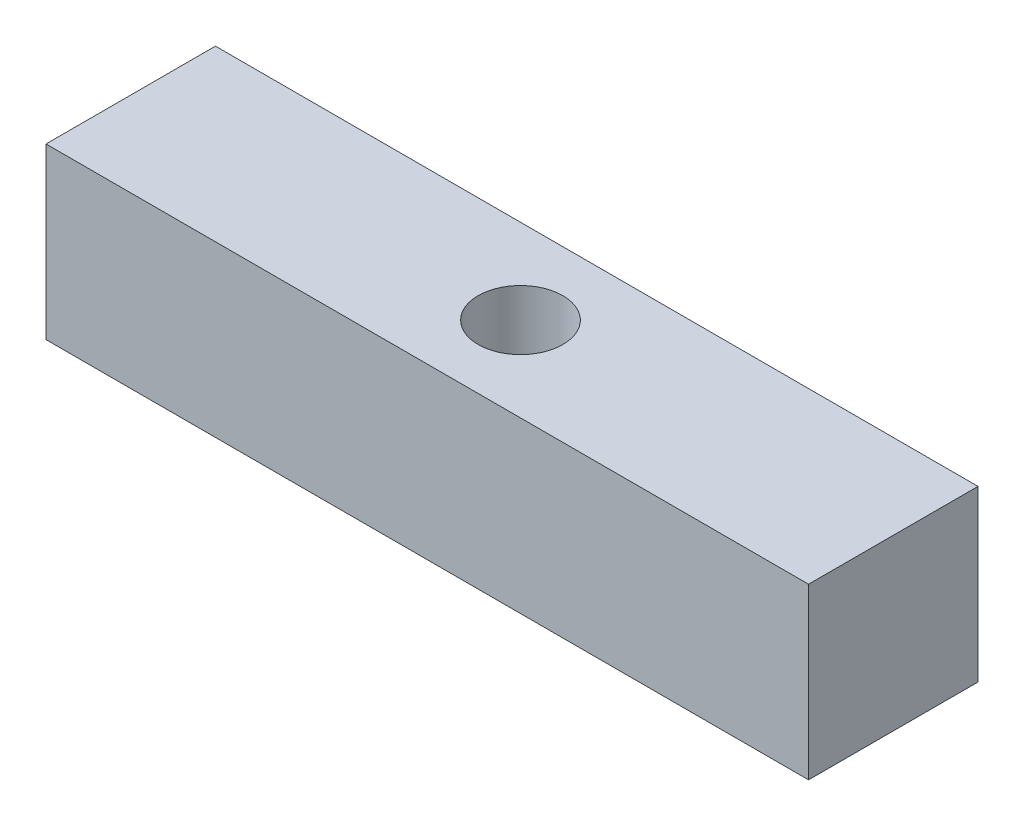
ISO-10303-21;
HEADER;
FILE_DESCRIPTION(('STEP AP214'),'2;1');
FILE_NAME('part.step','',(''),(''),'','','');
FILE_SCHEMA(('AUTOMOTIVE_DESIGN { 1 0 10303 214 1 1 1 1 }'));
ENDSEC;
DATA;
#1=APPLICATION_CONTEXT('core data for automotive mechanical design processes');
#2=APPLICATION_PROTOCOL_DEFINITION('international standard','automotive_design',2000,#1);
#3=PRODUCT_CONTEXT('',#1,'mechanical');
#4=PRODUCT('Part','Part','',(#3));
#5=PRODUCT_RELATED_PRODUCT_CATEGORY('part','',(#4));
#6=PRODUCT_DEFINITION_FORMATION('','',#4);
#7=PRODUCT_DEFINITION_CONTEXT('part definition',#1,'design');
#8=PRODUCT_DEFINITION('design','',#6,#7);
#9=PRODUCT_DEFINITION_SHAPE('','',#8);
#10=(LENGTH_UNIT() NAMED_UNIT(*) SI_UNIT(.MILLI.,.METRE.));
#11=(NAMED_UNIT(*) PLANE_ANGLE_UNIT() SI_UNIT($,.RADIAN.));
#12=(NAMED_UNIT(*) SI_UNIT($,.STERADIAN.) SOLID_ANGLE_UNIT());
#13=UNCERTAINTY_MEASURE_WITH_UNIT(LENGTH_MEASURE(1.E-05),#10,'distance_accuracy_value','');
#14=(GEOMETRIC_REPRESENTATION_CONTEXT(3) GLOBAL_UNCERTAINTY_ASSIGNED_CONTEXT((#13)) GLOBAL_UNIT_ASSIGNED_CONTEXT((#10,
#11,#12)) REPRESENTATION_CONTEXT('',''));
#15=CARTESIAN_POINT('',(0.,0.,0.));
#16=DIRECTION('',(0.,0.,1.));
#17=DIRECTION('',(1.,0.,0.));
#18=AXIS2_PLACEMENT_3D('',#15,#16,#17);
#19=CARTESIAN_POINT('',(-22.4999999999993,-41.5841446530855,5.));
#20=DIRECTION('',(1.,0.,0.));
#21=DIRECTION('',(0.,0.,-1.));
#22=AXIS2_PLACEMENT_3D('',#19,#20,#21);
#23=PLANE('',#22);
#24=DIRECTION('',(0.,-1.,0.));
#25=VECTOR('',#24,1.);
#26=CARTESIAN_POINT('',(-22.4999999999993,-41.5841446530855,-5.));
#27=LINE('',#26,#25);
#28=CARTESIAN_POINT('',(-22.4999999999993,-31.5841446530855,-5.));
#29=VERTEX_POINT('',#28);
#30=CARTESIAN_POINT('',(-22.4999999999993,-41.5841446530855,-5.));
#31=VERTEX_POINT('',#30);
#32=EDGE_CURVE('E93',#29,#31,#27,.T.);
#33=ORIENTED_EDGE('',*,*,#32,.T.);
#34=DIRECTION('',(0.,0.,-1.));
#35=VECTOR('',#34,1.);
#36=CARTESIAN_POINT('',(-22.4999999999993,-41.5841446530855,5.));
#37=LINE('',#36,#35);
#38=CARTESIAN_POINT('',(-22.4999999999993,-41.5841446530855,5.));
#39=VERTEX_POINT('',#38);
#40=EDGE_CURVE('E11',#39,#31,#37,.T.);
#41=ORIENTED_EDGE('',*,*,#40,.F.);
#42=DIRECTION('',(0.,-1.,0.));
#43=VECTOR('',#42,1.);
#44=CARTESIAN_POINT('',(-22.4999999999993,-41.5841446530855,5.));
#45=LINE('',#44,#43);
#46=CARTESIAN_POINT('',(-22.4999999999993,-31.5841446530855,5.));
#47=VERTEX_POINT('',#46);
#48=EDGE_CURVE('E81',#47,#39,#45,.T.);
#49=ORIENTED_EDGE('',*,*,#48,.F.);
#50=DIRECTION('',(0.,0.,-1.));
#51=VECTOR('',#50,1.);
#52=CARTESIAN_POINT('',(-22.4999999999993,-31.5841446530855,5.));
#53=LINE('',#52,#51);
#54=EDGE_CURVE('E89',#47,#29,#53,.T.);
#55=ORIENTED_EDGE('',*,*,#54,.T.);
#56=EDGE_LOOP('',(#33,#41,#49,#55));
#57=FACE_BOUND('',#56,.T.);
#58=ADVANCED_FACE('F30',(#57),#23,.F.);
#59=CARTESIAN_POINT('',(-22.4999999999993,-41.5841446530855,5.));
#60=DIRECTION('',(0.,1.,0.));
#61=DIRECTION('',(0.,0.,1.));
#62=AXIS2_PLACEMENT_3D('',#59,#60,#61);
#63=PLANE('',#62);
#64=CARTESIAN_POINT('',(0.501094214855904,-41.5841446530855,0.));
#65=DIRECTION('',(0.,-1.,0.));
#66=DIRECTION('',(0.,0.,-1.));
#67=AXIS2_PLACEMENT_3D('',#64,#65,#66);
#68=CIRCLE('',#67,2.5);
#69=CARTESIAN_POINT('',(0.501094214855904,-41.5841446530855,-2.5));
#70=VERTEX_POINT('',#69);
#71=EDGE_CURVE('E107',#70,#70,#68,.T.);
#72=ORIENTED_EDGE('',*,*,#71,.F.);
#73=EDGE_LOOP('',(#72));
#74=FACE_BOUND('',#73,.T.);
#75=DIRECTION('',(1.,0.,0.));
#76=VECTOR('',#75,1.);
#77=CARTESIAN_POINT('',(-22.4999999999993,-41.5841446530855,-5.));
#78=LINE('',#77,#76);
#79=CARTESIAN_POINT('',(22.5000000000006,-41.5841446530855,-5.));
#80=VERTEX_POINT('',#79);
#81=EDGE_CURVE('E85',#31,#80,#78,.T.);
#82=ORIENTED_EDGE('',*,*,#81,.T.);
#83=DIRECTION('',(0.,0.,-1.));
#84=VECTOR('',#83,1.);
#85=CARTESIAN_POINT('',(22.5000000000006,-41.5841446530855,5.));
#86=LINE('',#85,#84);
#87=CARTESIAN_POINT('',(22.5000000000006,-41.5841446530855,5.));
#88=VERTEX_POINT('',#87);
#89=EDGE_CURVE('E38',#88,#80,#86,.T.);
#90=ORIENTED_EDGE('',*,*,#89,.F.);
#91=DIRECTION('',(1.,0.,0.));
#92=VECTOR('',#91,1.);
#93=CARTESIAN_POINT('',(-22.4999999999993,-41.5841446530855,5.));
#94=LINE('',#93,#92);
#95=EDGE_CURVE('E76',#39,#88,#94,.T.);
#96=ORIENTED_EDGE('',*,*,#95,.F.);
#97=ORIENTED_EDGE('',*,*,#40,.T.);
#98=EDGE_LOOP('',(#82,#90,#96,#97));
#99=FACE_BOUND('',#98,.T.);
#100=ADVANCED_FACE('F84',(#74,#99),#63,.F.);
#101=CARTESIAN_POINT('',(22.5000000000006,-41.5841446530855,5.));
#102=DIRECTION('',(-1.,0.,0.));
#103=DIRECTION('',(0.,0.,1.));
#104=AXIS2_PLACEMENT_3D('',#101,#102,#103);
#105=PLANE('',#104);
#106=DIRECTION('',(0.,1.,0.));
#107=VECTOR('',#106,1.);
#108=CARTESIAN_POINT('',(22.5000000000006,-41.5841446530855,-5.));
#109=LINE('',#108,#107);
#110=CARTESIAN_POINT('',(22.5000000000006,-31.5841446530855,-5.));
#111=VERTEX_POINT('',#110);
#112=EDGE_CURVE('E63',#80,#111,#109,.T.);
#113=ORIENTED_EDGE('',*,*,#112,.T.);
#114=DIRECTION('',(0.,0.,-1.));
#115=VECTOR('',#114,1.);
#116=CARTESIAN_POINT('',(22.5000000000006,-31.5841446530855,5.));
#117=LINE('',#116,#115);
#118=CARTESIAN_POINT('',(22.5000000000006,-31.5841446530855,5.));
#119=VERTEX_POINT('',#118);
#120=EDGE_CURVE('E86',#119,#111,#117,.T.);
#121=ORIENTED_EDGE('',*,*,#120,.F.);
#122=DIRECTION('',(0.,1.,0.));
#123=VECTOR('',#122,1.);
#124=CARTESIAN_POINT('',(22.5000000000006,-41.5841446530855,5.));
#125=LINE('',#124,#123);
#126=EDGE_CURVE('E79',#88,#119,#125,.T.);
#127=ORIENTED_EDGE('',*,*,#126,.F.);
#128=ORIENTED_EDGE('',*,*,#89,.T.);
#129=EDGE_LOOP('',(#113,#121,#127,#128));
#130=FACE_BOUND('',#129,.T.);
#131=ADVANCED_FACE('F87',(#130),#105,.F.);
#132=CARTESIAN_POINT('',(-22.4999999999993,-31.5841446530855,5.));
#133=DIRECTION('',(0.,-1.,0.));
#134=DIRECTION('',(0.,0.,-1.));
#135=AXIS2_PLACEMENT_3D('',#132,#133,#134);
#136=PLANE('',#135);
#137=CARTESIAN_POINT('',(0.501094214855904,-31.5841446530855,0.));
#138=DIRECTION('',(0.,-1.,0.));
#139=DIRECTION('',(0.,0.,-1.));
#140=AXIS2_PLACEMENT_3D('',#137,#138,#139);
#141=CIRCLE('',#140,2.5);
#142=CARTESIAN_POINT('',(0.501094214855904,-31.5841446530855,-2.5));
#143=VERTEX_POINT('',#142);
#144=EDGE_CURVE('E96',#143,#143,#141,.T.);
#145=ORIENTED_EDGE('',*,*,#144,.T.);
#146=EDGE_LOOP('',(#145));
#147=FACE_BOUND('',#146,.T.);
#148=DIRECTION('',(-1.,0.,0.));
#149=VECTOR('',#148,1.);
#150=CARTESIAN_POINT('',(-22.4999999999993,-31.5841446530855,-5.));
#151=LINE('',#150,#149);
#152=EDGE_CURVE('E69',#111,#29,#151,.T.);
#153=ORIENTED_EDGE('',*,*,#152,.T.);
#154=ORIENTED_EDGE('',*,*,#54,.F.);
#155=DIRECTION('',(-1.,0.,0.));
#156=VECTOR('',#155,1.);
#157=CARTESIAN_POINT('',(-22.4999999999993,-31.5841446530855,5.));
#158=LINE('',#157,#156);
#159=EDGE_CURVE('E46',#119,#47,#158,.T.);
#160=ORIENTED_EDGE('',*,*,#159,.F.);
#161=ORIENTED_EDGE('',*,*,#120,.T.);
#162=EDGE_LOOP('',(#153,#154,#160,#161));
#163=FACE_BOUND('',#162,.T.);
#164=ADVANCED_FACE('F101',(#147,#163),#136,.F.);
#165=CARTESIAN_POINT('',(-22.4999999999993,-31.5841446530855,5.));
#166=DIRECTION('',(0.,0.,-1.));
#167=DIRECTION('',(-1.,0.,0.));
#168=AXIS2_PLACEMENT_3D('',#165,#166,#167);
#169=PLANE('',#168);
#170=ORIENTED_EDGE('',*,*,#48,.T.);
#171=ORIENTED_EDGE('',*,*,#95,.T.);
#172=ORIENTED_EDGE('',*,*,#126,.T.);
#173=ORIENTED_EDGE('',*,*,#159,.T.);
#174=EDGE_LOOP('',(#170,#171,#172,#173));
#175=FACE_BOUND('',#174,.T.);
#176=ADVANCED_FACE('F77',(#175),#169,.F.);
#177=CARTESIAN_POINT('',(-22.4999999999993,-31.5841446530855,-5.));
#178=DIRECTION('',(0.,0.,-1.));
#179=DIRECTION('',(-1.,0.,0.));
#180=AXIS2_PLACEMENT_3D('',#177,#178,#179);
#181=PLANE('',#180);
#182=ORIENTED_EDGE('',*,*,#32,.F.);
#183=ORIENTED_EDGE('',*,*,#152,.F.);
#184=ORIENTED_EDGE('',*,*,#112,.F.);
#185=ORIENTED_EDGE('',*,*,#81,.F.);
#186=EDGE_LOOP('',(#182,#183,#184,#185));
#187=FACE_BOUND('',#186,.T.);
#188=ADVANCED_FACE('F104',(#187),#181,.T.);
#189=CARTESIAN_POINT('',(0.501094214855904,-31.5841446530855,0.));
#190=DIRECTION('',(0.,-1.,0.));
#191=DIRECTION('',(0.,0.,-1.));
#192=AXIS2_PLACEMENT_3D('',#189,#190,#191);
#193=CYLINDRICAL_SURFACE('',#192,2.5);
#194=ORIENTED_EDGE('',*,*,#144,.F.);
#195=EDGE_LOOP('',(#194));
#196=FACE_BOUND('',#195,.T.);
#197=ORIENTED_EDGE('',*,*,#71,.T.);
#198=EDGE_LOOP('',(#197));
#199=FACE_BOUND('',#198,.T.);
#200=ADVANCED_FACE('F114',(#196,#199),#193,.F.);
#201=CLOSED_SHELL('',(#58,#100,#131,#164,#176,#188,#200));
#202=MANIFOLD_SOLID_BREP('B2',#201);
#203=ADVANCED_BREP_SHAPE_REPRESENTATION('',(#18,#202),#14);
#204=SHAPE_DEFINITION_REPRESENTATION(#9,#203);
ENDSEC;
END-ISO-10303-21;
